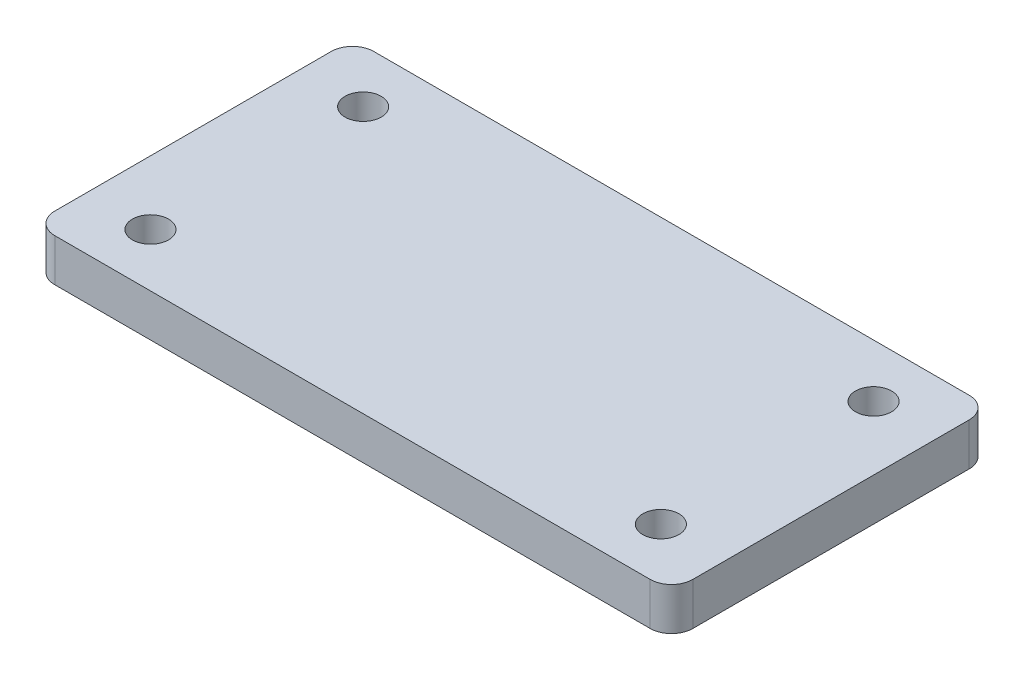
ISO-10303-21;
HEADER;
FILE_DESCRIPTION(('STEP AP214'),'2;1');
FILE_NAME('part.step','',(''),(''),'','','');
FILE_SCHEMA(('AUTOMOTIVE_DESIGN { 1 0 10303 214 1 1 1 1 }'));
ENDSEC;
DATA;
#1=APPLICATION_CONTEXT('core data for automotive mechanical design processes');
#2=APPLICATION_PROTOCOL_DEFINITION('international standard','automotive_design',2000,#1);
#3=PRODUCT_CONTEXT('',#1,'mechanical');
#4=PRODUCT('Part','Part','',(#3));
#5=PRODUCT_RELATED_PRODUCT_CATEGORY('part','',(#4));
#6=PRODUCT_DEFINITION_FORMATION('','',#4);
#7=PRODUCT_DEFINITION_CONTEXT('part definition',#1,'design');
#8=PRODUCT_DEFINITION('design','',#6,#7);
#9=PRODUCT_DEFINITION_SHAPE('','',#8);
#10=(LENGTH_UNIT() NAMED_UNIT(*) SI_UNIT(.MILLI.,.METRE.));
#11=(NAMED_UNIT(*) PLANE_ANGLE_UNIT() SI_UNIT($,.RADIAN.));
#12=(NAMED_UNIT(*) SI_UNIT($,.STERADIAN.) SOLID_ANGLE_UNIT());
#13=UNCERTAINTY_MEASURE_WITH_UNIT(LENGTH_MEASURE(1.E-05),#10,'distance_accuracy_value','');
#14=(GEOMETRIC_REPRESENTATION_CONTEXT(3) GLOBAL_UNCERTAINTY_ASSIGNED_CONTEXT((#13)) GLOBAL_UNIT_ASSIGNED_CONTEXT((#10,
#11,#12)) REPRESENTATION_CONTEXT('',''));
#15=CARTESIAN_POINT('',(0.,0.,0.));
#16=DIRECTION('',(0.,0.,1.));
#17=DIRECTION('',(1.,0.,0.));
#18=AXIS2_PLACEMENT_3D('',#15,#16,#17);
#19=CARTESIAN_POINT('',(150.,20.,75.));
#20=DIRECTION('',(-1.,0.,0.));
#21=DIRECTION('',(0.,0.,1.));
#22=AXIS2_PLACEMENT_3D('',#19,#20,#21);
#23=PLANE('',#22);
#24=DIRECTION('',(0.,0.,-1.));
#25=VECTOR('',#24,1.);
#26=CARTESIAN_POINT('',(150.,0.,75.));
#27=LINE('',#26,#25);
#28=CARTESIAN_POINT('',(150.,0.,65.));
#29=VERTEX_POINT('',#28);
#30=CARTESIAN_POINT('',(150.,0.,-65.));
#31=VERTEX_POINT('',#30);
#32=EDGE_CURVE('E136',#29,#31,#27,.T.);
#33=ORIENTED_EDGE('',*,*,#32,.T.);
#34=DIRECTION('',(0.,-1.,0.));
#35=VECTOR('',#34,1.);
#36=CARTESIAN_POINT('',(150.,20.,-65.));
#37=LINE('',#36,#35);
#38=CARTESIAN_POINT('',(150.,20.,-65.));
#39=VERTEX_POINT('',#38);
#40=EDGE_CURVE('E111',#31,#39,#37,.F.);
#41=ORIENTED_EDGE('',*,*,#40,.T.);
#42=DIRECTION('',(0.,0.,-1.));
#43=VECTOR('',#42,1.);
#44=CARTESIAN_POINT('',(150.,20.,75.));
#45=LINE('',#44,#43);
#46=CARTESIAN_POINT('',(150.,20.,65.));
#47=VERTEX_POINT('',#46);
#48=EDGE_CURVE('E149',#47,#39,#45,.T.);
#49=ORIENTED_EDGE('',*,*,#48,.F.);
#50=DIRECTION('',(0.,-1.,0.));
#51=VECTOR('',#50,1.);
#52=CARTESIAN_POINT('',(150.,20.,65.));
#53=LINE('',#52,#51);
#54=EDGE_CURVE('E117',#47,#29,#53,.T.);
#55=ORIENTED_EDGE('',*,*,#54,.T.);
#56=EDGE_LOOP('',(#33,#41,#49,#55));
#57=FACE_BOUND('',#56,.T.);
#58=ADVANCED_FACE('F39',(#57),#23,.F.);
#59=CARTESIAN_POINT('',(-150.,20.,-75.));
#60=DIRECTION('',(0.,0.,1.));
#61=DIRECTION('',(1.,0.,0.));
#62=AXIS2_PLACEMENT_3D('',#59,#60,#61);
#63=PLANE('',#62);
#64=DIRECTION('',(-1.,0.,0.));
#65=VECTOR('',#64,1.);
#66=CARTESIAN_POINT('',(-150.,20.,-75.));
#67=LINE('',#66,#65);
#68=CARTESIAN_POINT('',(140.,20.,-75.));
#69=VERTEX_POINT('',#68);
#70=CARTESIAN_POINT('',(-140.,20.,-75.));
#71=VERTEX_POINT('',#70);
#72=EDGE_CURVE('E127',#69,#71,#67,.T.);
#73=ORIENTED_EDGE('',*,*,#72,.F.);
#74=DIRECTION('',(0.,-1.,0.));
#75=VECTOR('',#74,1.);
#76=CARTESIAN_POINT('',(140.,20.,-75.));
#77=LINE('',#76,#75);
#78=CARTESIAN_POINT('',(140.,0.,-75.));
#79=VERTEX_POINT('',#78);
#80=EDGE_CURVE('E110',#69,#79,#77,.T.);
#81=ORIENTED_EDGE('',*,*,#80,.T.);
#82=DIRECTION('',(-1.,0.,0.));
#83=VECTOR('',#82,1.);
#84=CARTESIAN_POINT('',(-150.,0.,-75.));
#85=LINE('',#84,#83);
#86=CARTESIAN_POINT('',(-140.,0.,-75.));
#87=VERTEX_POINT('',#86);
#88=EDGE_CURVE('E124',#79,#87,#85,.T.);
#89=ORIENTED_EDGE('',*,*,#88,.T.);
#90=DIRECTION('',(0.,-1.,0.));
#91=VECTOR('',#90,1.);
#92=CARTESIAN_POINT('',(-140.,20.,-75.));
#93=LINE('',#92,#91);
#94=EDGE_CURVE('E130',#87,#71,#93,.F.);
#95=ORIENTED_EDGE('',*,*,#94,.T.);
#96=EDGE_LOOP('',(#73,#81,#89,#95));
#97=FACE_BOUND('',#96,.T.);
#98=ADVANCED_FACE('F123',(#97),#63,.F.);
#99=CARTESIAN_POINT('',(-150.,20.,75.));
#100=DIRECTION('',(1.,0.,0.));
#101=DIRECTION('',(0.,0.,-1.));
#102=AXIS2_PLACEMENT_3D('',#99,#100,#101);
#103=PLANE('',#102);
#104=DIRECTION('',(0.,0.,1.));
#105=VECTOR('',#104,1.);
#106=CARTESIAN_POINT('',(-150.,0.,75.));
#107=LINE('',#106,#105);
#108=CARTESIAN_POINT('',(-150.,0.,-65.));
#109=VERTEX_POINT('',#108);
#110=CARTESIAN_POINT('',(-150.,0.,65.));
#111=VERTEX_POINT('',#110);
#112=EDGE_CURVE('E135',#109,#111,#107,.T.);
#113=ORIENTED_EDGE('',*,*,#112,.T.);
#114=DIRECTION('',(0.,-1.,0.));
#115=VECTOR('',#114,1.);
#116=CARTESIAN_POINT('',(-150.,20.,65.));
#117=LINE('',#116,#115);
#118=CARTESIAN_POINT('',(-150.,20.,65.));
#119=VERTEX_POINT('',#118);
#120=EDGE_CURVE('E11',#111,#119,#117,.F.);
#121=ORIENTED_EDGE('',*,*,#120,.T.);
#122=DIRECTION('',(0.,0.,1.));
#123=VECTOR('',#122,1.);
#124=CARTESIAN_POINT('',(-150.,20.,75.));
#125=LINE('',#124,#123);
#126=CARTESIAN_POINT('',(-150.,20.,-65.));
#127=VERTEX_POINT('',#126);
#128=EDGE_CURVE('E188',#127,#119,#125,.T.);
#129=ORIENTED_EDGE('',*,*,#128,.F.);
#130=DIRECTION('',(0.,-1.,0.));
#131=VECTOR('',#130,1.);
#132=CARTESIAN_POINT('',(-150.,20.,-65.));
#133=LINE('',#132,#131);
#134=EDGE_CURVE('E48',#127,#109,#133,.T.);
#135=ORIENTED_EDGE('',*,*,#134,.T.);
#136=EDGE_LOOP('',(#113,#121,#129,#135));
#137=FACE_BOUND('',#136,.T.);
#138=ADVANCED_FACE('F186',(#137),#103,.F.);
#139=CARTESIAN_POINT('',(-150.,20.,75.));
#140=DIRECTION('',(0.,0.,-1.));
#141=DIRECTION('',(-1.,0.,0.));
#142=AXIS2_PLACEMENT_3D('',#139,#140,#141);
#143=PLANE('',#142);
#144=DIRECTION('',(1.,0.,0.));
#145=VECTOR('',#144,1.);
#146=CARTESIAN_POINT('',(-150.,0.,75.));
#147=LINE('',#146,#145);
#148=CARTESIAN_POINT('',(-140.,0.,75.));
#149=VERTEX_POINT('',#148);
#150=CARTESIAN_POINT('',(140.,0.,75.));
#151=VERTEX_POINT('',#150);
#152=EDGE_CURVE('E141',#149,#151,#147,.T.);
#153=ORIENTED_EDGE('',*,*,#152,.T.);
#154=DIRECTION('',(0.,-1.,0.));
#155=VECTOR('',#154,1.);
#156=CARTESIAN_POINT('',(140.,20.,75.));
#157=LINE('',#156,#155);
#158=CARTESIAN_POINT('',(140.,20.,75.));
#159=VERTEX_POINT('',#158);
#160=EDGE_CURVE('E55',#151,#159,#157,.F.);
#161=ORIENTED_EDGE('',*,*,#160,.T.);
#162=DIRECTION('',(1.,0.,0.));
#163=VECTOR('',#162,1.);
#164=CARTESIAN_POINT('',(-150.,20.,75.));
#165=LINE('',#164,#163);
#166=CARTESIAN_POINT('',(-140.,20.,75.));
#167=VERTEX_POINT('',#166);
#168=EDGE_CURVE('E151',#167,#159,#165,.T.);
#169=ORIENTED_EDGE('',*,*,#168,.F.);
#170=DIRECTION('',(0.,-1.,0.));
#171=VECTOR('',#170,1.);
#172=CARTESIAN_POINT('',(-140.,20.,75.));
#173=LINE('',#172,#171);
#174=EDGE_CURVE('E176',#167,#149,#173,.T.);
#175=ORIENTED_EDGE('',*,*,#174,.T.);
#176=EDGE_LOOP('',(#153,#161,#169,#175));
#177=FACE_BOUND('',#176,.T.);
#178=ADVANCED_FACE('F195',(#177),#143,.F.);
#179=CARTESIAN_POINT('',(0.,20.,0.));
#180=DIRECTION('',(0.,-1.,0.));
#181=DIRECTION('',(0.,0.,-1.));
#182=AXIS2_PLACEMENT_3D('',#179,#180,#181);
#183=PLANE('',#182);
#184=CARTESIAN_POINT('',(-120.,20.,-50.));
#185=DIRECTION('',(0.,1.,0.));
#186=DIRECTION('',(0.,0.,1.));
#187=AXIS2_PLACEMENT_3D('',#184,#185,#186);
#188=CIRCLE('',#187,8.50000000000001);
#189=CARTESIAN_POINT('',(-120.,20.,-41.5));
#190=VERTEX_POINT('',#189);
#191=EDGE_CURVE('E233',#190,#190,#188,.T.);
#192=ORIENTED_EDGE('',*,*,#191,.F.);
#193=EDGE_LOOP('',(#192));
#194=FACE_BOUND('',#193,.T.);
#195=CARTESIAN_POINT('',(-120.,20.,50.));
#196=DIRECTION('',(0.,1.,0.));
#197=DIRECTION('',(0.,0.,1.));
#198=AXIS2_PLACEMENT_3D('',#195,#196,#197);
#199=CIRCLE('',#198,8.50000000000001);
#200=CARTESIAN_POINT('',(-120.,20.,58.5));
#201=VERTEX_POINT('',#200);
#202=EDGE_CURVE('E225',#201,#201,#199,.T.);
#203=ORIENTED_EDGE('',*,*,#202,.F.);
#204=EDGE_LOOP('',(#203));
#205=FACE_BOUND('',#204,.T.);
#206=CARTESIAN_POINT('',(120.,20.,-50.));
#207=DIRECTION('',(0.,1.,0.));
#208=DIRECTION('',(0.,0.,1.));
#209=AXIS2_PLACEMENT_3D('',#206,#207,#208);
#210=CIRCLE('',#209,8.50000000000001);
#211=CARTESIAN_POINT('',(120.,20.,-41.5));
#212=VERTEX_POINT('',#211);
#213=EDGE_CURVE('E217',#212,#212,#210,.T.);
#214=ORIENTED_EDGE('',*,*,#213,.F.);
#215=EDGE_LOOP('',(#214));
#216=FACE_BOUND('',#215,.T.);
#217=CARTESIAN_POINT('',(120.,20.,50.));
#218=DIRECTION('',(0.,1.,0.));
#219=DIRECTION('',(0.,0.,1.));
#220=AXIS2_PLACEMENT_3D('',#217,#218,#219);
#221=CIRCLE('',#220,8.50000000000001);
#222=CARTESIAN_POINT('',(120.,20.,58.5));
#223=VERTEX_POINT('',#222);
#224=EDGE_CURVE('E209',#223,#223,#221,.T.);
#225=ORIENTED_EDGE('',*,*,#224,.F.);
#226=EDGE_LOOP('',(#225));
#227=FACE_BOUND('',#226,.T.);
#228=ORIENTED_EDGE('',*,*,#48,.T.);
#229=CARTESIAN_POINT('',(140.,20.,-65.));
#230=DIRECTION('',(0.,-1.,0.));
#231=DIRECTION('',(0.,0.,-1.));
#232=AXIS2_PLACEMENT_3D('',#229,#230,#231);
#233=CIRCLE('',#232,10.);
#234=EDGE_CURVE('E173',#39,#69,#233,.F.);
#235=ORIENTED_EDGE('',*,*,#234,.T.);
#236=ORIENTED_EDGE('',*,*,#72,.T.);
#237=CARTESIAN_POINT('',(-140.,20.,-65.));
#238=DIRECTION('',(0.,-1.,0.));
#239=DIRECTION('',(0.,0.,-1.));
#240=AXIS2_PLACEMENT_3D('',#237,#238,#239);
#241=CIRCLE('',#240,10.);
#242=EDGE_CURVE('E165',#71,#127,#241,.F.);
#243=ORIENTED_EDGE('',*,*,#242,.T.);
#244=ORIENTED_EDGE('',*,*,#128,.T.);
#245=CARTESIAN_POINT('',(-140.,20.,65.));
#246=DIRECTION('',(0.,-1.,0.));
#247=DIRECTION('',(0.,0.,-1.));
#248=AXIS2_PLACEMENT_3D('',#245,#246,#247);
#249=CIRCLE('',#248,10.);
#250=EDGE_CURVE('E62',#119,#167,#249,.F.);
#251=ORIENTED_EDGE('',*,*,#250,.T.);
#252=ORIENTED_EDGE('',*,*,#168,.T.);
#253=CARTESIAN_POINT('',(140.,20.,65.));
#254=DIRECTION('',(0.,-1.,0.));
#255=DIRECTION('',(0.,0.,-1.));
#256=AXIS2_PLACEMENT_3D('',#253,#254,#255);
#257=CIRCLE('',#256,10.);
#258=EDGE_CURVE('E170',#159,#47,#257,.F.);
#259=ORIENTED_EDGE('',*,*,#258,.T.);
#260=EDGE_LOOP('',(#228,#235,#236,#243,#244,#251,#252,#259));
#261=FACE_BOUND('',#260,.T.);
#262=ADVANCED_FACE('F240',(#194,#205,#216,#227,#261),#183,.F.);
#263=CARTESIAN_POINT('',(0.,0.,0.));
#264=DIRECTION('',(0.,-1.,0.));
#265=DIRECTION('',(0.,0.,-1.));
#266=AXIS2_PLACEMENT_3D('',#263,#264,#265);
#267=PLANE('',#266);
#268=CARTESIAN_POINT('',(-120.,0.,-50.));
#269=DIRECTION('',(0.,1.,0.));
#270=DIRECTION('',(0.,0.,1.));
#271=AXIS2_PLACEMENT_3D('',#268,#269,#270);
#272=CIRCLE('',#271,8.49999999999999);
#273=CARTESIAN_POINT('',(-120.,0.,-41.5));
#274=VERTEX_POINT('',#273);
#275=EDGE_CURVE('E229',#274,#274,#272,.T.);
#276=ORIENTED_EDGE('',*,*,#275,.T.);
#277=EDGE_LOOP('',(#276));
#278=FACE_BOUND('',#277,.T.);
#279=CARTESIAN_POINT('',(-120.,0.,50.));
#280=DIRECTION('',(0.,1.,0.));
#281=DIRECTION('',(0.,0.,1.));
#282=AXIS2_PLACEMENT_3D('',#279,#280,#281);
#283=CIRCLE('',#282,8.49999999999999);
#284=CARTESIAN_POINT('',(-120.,0.,58.5));
#285=VERTEX_POINT('',#284);
#286=EDGE_CURVE('E221',#285,#285,#283,.T.);
#287=ORIENTED_EDGE('',*,*,#286,.T.);
#288=EDGE_LOOP('',(#287));
#289=FACE_BOUND('',#288,.T.);
#290=CARTESIAN_POINT('',(120.,0.,-50.));
#291=DIRECTION('',(0.,1.,0.));
#292=DIRECTION('',(0.,0.,1.));
#293=AXIS2_PLACEMENT_3D('',#290,#291,#292);
#294=CIRCLE('',#293,8.50000000000001);
#295=CARTESIAN_POINT('',(120.,0.,-41.5));
#296=VERTEX_POINT('',#295);
#297=EDGE_CURVE('E213',#296,#296,#294,.T.);
#298=ORIENTED_EDGE('',*,*,#297,.T.);
#299=EDGE_LOOP('',(#298));
#300=FACE_BOUND('',#299,.T.);
#301=CARTESIAN_POINT('',(120.,0.,50.));
#302=DIRECTION('',(0.,1.,0.));
#303=DIRECTION('',(0.,0.,1.));
#304=AXIS2_PLACEMENT_3D('',#301,#302,#303);
#305=CIRCLE('',#304,8.50000000000001);
#306=CARTESIAN_POINT('',(120.,0.,58.5));
#307=VERTEX_POINT('',#306);
#308=EDGE_CURVE('E143',#307,#307,#305,.T.);
#309=ORIENTED_EDGE('',*,*,#308,.T.);
#310=EDGE_LOOP('',(#309));
#311=FACE_BOUND('',#310,.T.);
#312=ORIENTED_EDGE('',*,*,#88,.F.);
#313=CARTESIAN_POINT('',(140.,0.,-65.));
#314=DIRECTION('',(0.,-1.,0.));
#315=DIRECTION('',(0.,0.,-1.));
#316=AXIS2_PLACEMENT_3D('',#313,#314,#315);
#317=CIRCLE('',#316,10.);
#318=EDGE_CURVE('E106',#79,#31,#317,.T.);
#319=ORIENTED_EDGE('',*,*,#318,.T.);
#320=ORIENTED_EDGE('',*,*,#32,.F.);
#321=CARTESIAN_POINT('',(140.,0.,65.));
#322=DIRECTION('',(0.,-1.,0.));
#323=DIRECTION('',(0.,0.,-1.));
#324=AXIS2_PLACEMENT_3D('',#321,#322,#323);
#325=CIRCLE('',#324,10.);
#326=EDGE_CURVE('E118',#29,#151,#325,.T.);
#327=ORIENTED_EDGE('',*,*,#326,.T.);
#328=ORIENTED_EDGE('',*,*,#152,.F.);
#329=CARTESIAN_POINT('',(-140.,0.,65.));
#330=DIRECTION('',(0.,-1.,0.));
#331=DIRECTION('',(0.,0.,-1.));
#332=AXIS2_PLACEMENT_3D('',#329,#330,#331);
#333=CIRCLE('',#332,10.);
#334=EDGE_CURVE('E155',#149,#111,#333,.T.);
#335=ORIENTED_EDGE('',*,*,#334,.T.);
#336=ORIENTED_EDGE('',*,*,#112,.F.);
#337=CARTESIAN_POINT('',(-140.,0.,-65.));
#338=DIRECTION('',(0.,-1.,0.));
#339=DIRECTION('',(0.,0.,-1.));
#340=AXIS2_PLACEMENT_3D('',#337,#338,#339);
#341=CIRCLE('',#340,10.);
#342=EDGE_CURVE('E129',#109,#87,#341,.T.);
#343=ORIENTED_EDGE('',*,*,#342,.T.);
#344=EDGE_LOOP('',(#312,#319,#320,#327,#328,#335,#336,#343));
#345=FACE_BOUND('',#344,.T.);
#346=ADVANCED_FACE('F132',(#278,#289,#300,#311,#345),#267,.T.);
#347=CARTESIAN_POINT('',(140.,20.,-65.));
#348=DIRECTION('',(0.,-1.,0.));
#349=DIRECTION('',(0.,0.,-1.));
#350=AXIS2_PLACEMENT_3D('',#347,#348,#349);
#351=CYLINDRICAL_SURFACE('',#350,10.);
#352=ORIENTED_EDGE('',*,*,#234,.F.);
#353=ORIENTED_EDGE('',*,*,#40,.F.);
#354=ORIENTED_EDGE('',*,*,#318,.F.);
#355=ORIENTED_EDGE('',*,*,#80,.F.);
#356=EDGE_LOOP('',(#352,#353,#354,#355));
#357=FACE_BOUND('',#356,.T.);
#358=ADVANCED_FACE('F109',(#357),#351,.T.);
#359=CARTESIAN_POINT('',(140.,20.,65.));
#360=DIRECTION('',(0.,-1.,0.));
#361=DIRECTION('',(0.,0.,-1.));
#362=AXIS2_PLACEMENT_3D('',#359,#360,#361);
#363=CYLINDRICAL_SURFACE('',#362,10.);
#364=ORIENTED_EDGE('',*,*,#258,.F.);
#365=ORIENTED_EDGE('',*,*,#160,.F.);
#366=ORIENTED_EDGE('',*,*,#326,.F.);
#367=ORIENTED_EDGE('',*,*,#54,.F.);
#368=EDGE_LOOP('',(#364,#365,#366,#367));
#369=FACE_BOUND('',#368,.T.);
#370=ADVANCED_FACE('F253',(#369),#363,.T.);
#371=CARTESIAN_POINT('',(-140.,20.,65.));
#372=DIRECTION('',(0.,-1.,0.));
#373=DIRECTION('',(0.,0.,-1.));
#374=AXIS2_PLACEMENT_3D('',#371,#372,#373);
#375=CYLINDRICAL_SURFACE('',#374,10.);
#376=ORIENTED_EDGE('',*,*,#250,.F.);
#377=ORIENTED_EDGE('',*,*,#120,.F.);
#378=ORIENTED_EDGE('',*,*,#334,.F.);
#379=ORIENTED_EDGE('',*,*,#174,.F.);
#380=EDGE_LOOP('',(#376,#377,#378,#379));
#381=FACE_BOUND('',#380,.T.);
#382=ADVANCED_FACE('F194',(#381),#375,.T.);
#383=CARTESIAN_POINT('',(-140.,20.,-65.));
#384=DIRECTION('',(0.,-1.,0.));
#385=DIRECTION('',(0.,0.,-1.));
#386=AXIS2_PLACEMENT_3D('',#383,#384,#385);
#387=CYLINDRICAL_SURFACE('',#386,10.);
#388=ORIENTED_EDGE('',*,*,#242,.F.);
#389=ORIENTED_EDGE('',*,*,#94,.F.);
#390=ORIENTED_EDGE('',*,*,#342,.F.);
#391=ORIENTED_EDGE('',*,*,#134,.F.);
#392=EDGE_LOOP('',(#388,#389,#390,#391));
#393=FACE_BOUND('',#392,.T.);
#394=ADVANCED_FACE('F41',(#393),#387,.T.);
#395=CARTESIAN_POINT('',(120.,20.,50.));
#396=DIRECTION('',(0.,1.,0.));
#397=DIRECTION('',(0.,0.,1.));
#398=AXIS2_PLACEMENT_3D('',#395,#396,#397);
#399=CYLINDRICAL_SURFACE('',#398,8.50000000000001);
#400=ORIENTED_EDGE('',*,*,#308,.F.);
#401=EDGE_LOOP('',(#400));
#402=FACE_BOUND('',#401,.T.);
#403=ORIENTED_EDGE('',*,*,#224,.T.);
#404=EDGE_LOOP('',(#403));
#405=FACE_BOUND('',#404,.T.);
#406=ADVANCED_FACE('F275',(#402,#405),#399,.F.);
#407=CARTESIAN_POINT('',(120.,20.,-50.));
#408=DIRECTION('',(0.,1.,0.));
#409=DIRECTION('',(0.,0.,1.));
#410=AXIS2_PLACEMENT_3D('',#407,#408,#409);
#411=CYLINDRICAL_SURFACE('',#410,8.50000000000001);
#412=ORIENTED_EDGE('',*,*,#297,.F.);
#413=EDGE_LOOP('',(#412));
#414=FACE_BOUND('',#413,.T.);
#415=ORIENTED_EDGE('',*,*,#213,.T.);
#416=EDGE_LOOP('',(#415));
#417=FACE_BOUND('',#416,.T.);
#418=ADVANCED_FACE('F278',(#414,#417),#411,.F.);
#419=CARTESIAN_POINT('',(-120.,20.,50.));
#420=DIRECTION('',(0.,1.,0.));
#421=DIRECTION('',(0.,0.,1.));
#422=AXIS2_PLACEMENT_3D('',#419,#420,#421);
#423=CYLINDRICAL_SURFACE('',#422,8.5);
#424=ORIENTED_EDGE('',*,*,#286,.F.);
#425=EDGE_LOOP('',(#424));
#426=FACE_BOUND('',#425,.T.);
#427=ORIENTED_EDGE('',*,*,#202,.T.);
#428=EDGE_LOOP('',(#427));
#429=FACE_BOUND('',#428,.T.);
#430=ADVANCED_FACE('F282',(#426,#429),#423,.F.);
#431=CARTESIAN_POINT('',(-120.,20.,-50.));
#432=DIRECTION('',(0.,1.,0.));
#433=DIRECTION('',(0.,0.,1.));
#434=AXIS2_PLACEMENT_3D('',#431,#432,#433);
#435=CYLINDRICAL_SURFACE('',#434,8.5);
#436=ORIENTED_EDGE('',*,*,#275,.F.);
#437=EDGE_LOOP('',(#436));
#438=FACE_BOUND('',#437,.T.);
#439=ORIENTED_EDGE('',*,*,#191,.T.);
#440=EDGE_LOOP('',(#439));
#441=FACE_BOUND('',#440,.T.);
#442=ADVANCED_FACE('F238',(#438,#441),#435,.F.);
#443=CLOSED_SHELL('',(#58,#98,#138,#178,#262,#346,#358,#370,#382,#394,#406,#418,#430,#442));
#444=MANIFOLD_SOLID_BREP('B2',#443);
#445=ADVANCED_BREP_SHAPE_REPRESENTATION('',(#18,#444),#14);
#446=SHAPE_DEFINITION_REPRESENTATION(#9,#445);
ENDSEC;
END-ISO-10303-21;
